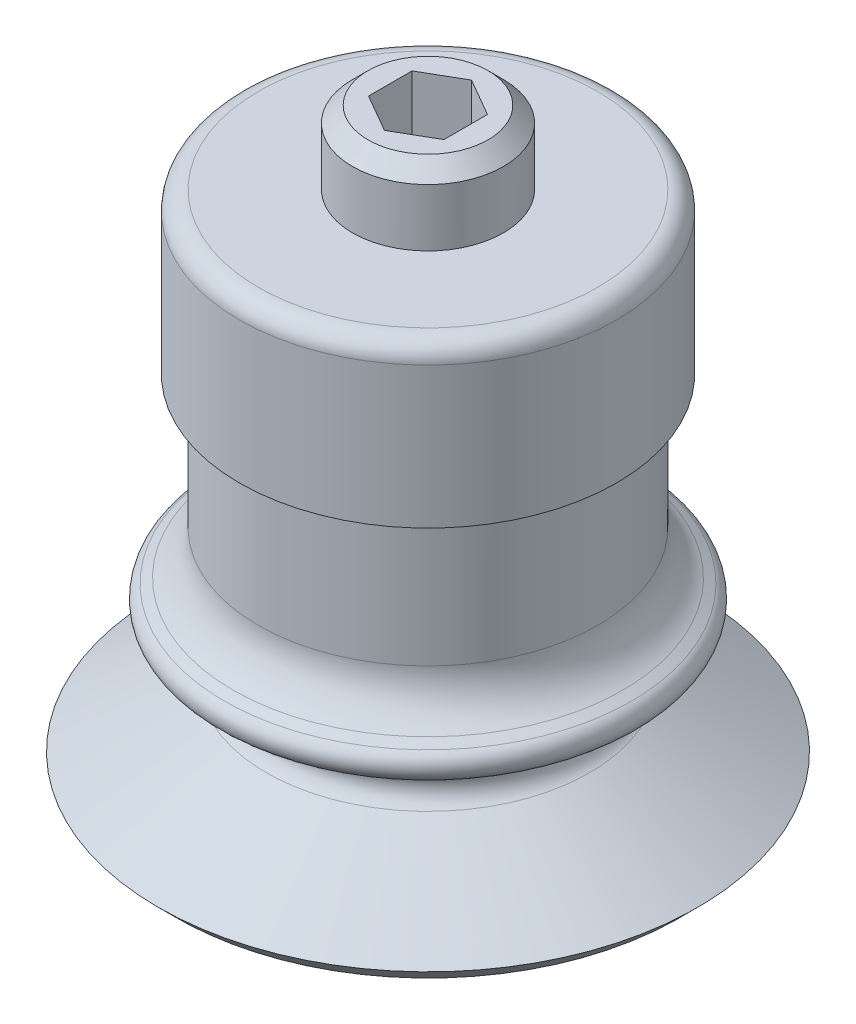
ISO-10303-21;
HEADER;
FILE_DESCRIPTION(('STEP AP214'),'2;1');
FILE_NAME('part.step','',(''),(''),'','','');
FILE_SCHEMA(('AUTOMOTIVE_DESIGN { 1 0 10303 214 1 1 1 1 }'));
ENDSEC;
DATA;
#1=APPLICATION_CONTEXT('core data for automotive mechanical design processes');
#2=APPLICATION_PROTOCOL_DEFINITION('international standard','automotive_design',2000,#1);
#3=PRODUCT_CONTEXT('',#1,'mechanical');
#4=PRODUCT('Part','Part','',(#3));
#5=PRODUCT_RELATED_PRODUCT_CATEGORY('part','',(#4));
#6=PRODUCT_DEFINITION_FORMATION('','',#4);
#7=PRODUCT_DEFINITION_CONTEXT('part definition',#1,'design');
#8=PRODUCT_DEFINITION('design','',#6,#7);
#9=PRODUCT_DEFINITION_SHAPE('','',#8);
#10=(LENGTH_UNIT() NAMED_UNIT(*) SI_UNIT(.MILLI.,.METRE.));
#11=(NAMED_UNIT(*) PLANE_ANGLE_UNIT() SI_UNIT($,.RADIAN.));
#12=(NAMED_UNIT(*) SI_UNIT($,.STERADIAN.) SOLID_ANGLE_UNIT());
#13=UNCERTAINTY_MEASURE_WITH_UNIT(LENGTH_MEASURE(1.E-05),#10,'distance_accuracy_value','');
#14=(GEOMETRIC_REPRESENTATION_CONTEXT(3) GLOBAL_UNCERTAINTY_ASSIGNED_CONTEXT((#13)) GLOBAL_UNIT_ASSIGNED_CONTEXT((#10,
#11,#12)) REPRESENTATION_CONTEXT('',''));
#15=CARTESIAN_POINT('',(0.,0.,0.));
#16=DIRECTION('',(0.,0.,1.));
#17=DIRECTION('',(1.,0.,0.));
#18=AXIS2_PLACEMENT_3D('',#15,#16,#17);
#19=CARTESIAN_POINT('',(0.,18.2,0.));
#20=DIRECTION('',(0.,1.,0.));
#21=DIRECTION('',(0.,0.,1.));
#22=AXIS2_PLACEMENT_3D('',#19,#20,#21);
#23=CYLINDRICAL_SURFACE('',#22,6.75);
#24=CARTESIAN_POINT('',(0.,8.45373864405591,0.));
#25=DIRECTION('',(0.,1.,0.));
#26=DIRECTION('',(0.,0.,1.));
#27=AXIS2_PLACEMENT_3D('',#24,#25,#26);
#28=CIRCLE('',#27,6.75);
#29=CARTESIAN_POINT('',(0.,8.45373864405591,6.75));
#30=VERTEX_POINT('',#29);
#31=EDGE_CURVE('E125',#30,#30,#28,.T.);
#32=ORIENTED_EDGE('',*,*,#31,.T.);
#33=EDGE_LOOP('',(#32));
#34=FACE_BOUND('',#33,.T.);
#35=CARTESIAN_POINT('',(0.,13.7333333333333,0.));
#36=DIRECTION('',(0.,1.,0.));
#37=DIRECTION('',(0.,0.,1.));
#38=AXIS2_PLACEMENT_3D('',#35,#36,#37);
#39=CIRCLE('',#38,6.75);
#40=CARTESIAN_POINT('',(0.,13.7333333333333,6.75));
#41=VERTEX_POINT('',#40);
#42=EDGE_CURVE('E21',#41,#41,#39,.F.);
#43=ORIENTED_EDGE('',*,*,#42,.T.);
#44=EDGE_LOOP('',(#43));
#45=FACE_BOUND('',#44,.T.);
#46=ADVANCED_FACE('F17',(#34,#45),#23,.T.);
#47=CARTESIAN_POINT('',(7.5,13.7333333333333,0.));
#48=DIRECTION('',(0.,1.,0.));
#49=DIRECTION('',(0.,0.,1.));
#50=AXIS2_PLACEMENT_3D('',#47,#48,#49);
#51=PLANE('',#50);
#52=ORIENTED_EDGE('',*,*,#42,.F.);
#53=EDGE_LOOP('',(#52));
#54=FACE_BOUND('',#53,.T.);
#55=CARTESIAN_POINT('',(0.,13.7333333333333,0.));
#56=DIRECTION('',(0.,1.,0.));
#57=DIRECTION('',(0.,0.,1.));
#58=AXIS2_PLACEMENT_3D('',#55,#56,#57);
#59=CIRCLE('',#58,7.5);
#60=CARTESIAN_POINT('',(0.,13.7333333333333,7.5));
#61=VERTEX_POINT('',#60);
#62=EDGE_CURVE('E122',#61,#61,#59,.T.);
#63=ORIENTED_EDGE('',*,*,#62,.F.);
#64=EDGE_LOOP('',(#63));
#65=FACE_BOUND('',#64,.T.);
#66=ADVANCED_FACE('F144',(#54,#65),#51,.F.);
#67=CARTESIAN_POINT('',(0.,8.45373864405591,0.));
#68=DIRECTION('',(0.,-1.,0.));
#69=DIRECTION('',(0.,0.,-1.));
#70=AXIS2_PLACEMENT_3D('',#67,#68,#69);
#71=TOROIDAL_SURFACE('',#70,8.75000000000001,2.);
#72=CARTESIAN_POINT('',(0.,6.72168783648703,0.));
#73=DIRECTION('',(0.,-1.,0.));
#74=DIRECTION('',(0.,0.,-1.));
#75=AXIS2_PLACEMENT_3D('',#72,#73,#74);
#76=CIRCLE('',#75,7.75);
#77=CARTESIAN_POINT('',(0.,6.72168783648703,-7.75));
#78=VERTEX_POINT('',#77);
#79=EDGE_CURVE('E117',#78,#78,#76,.T.);
#80=ORIENTED_EDGE('',*,*,#79,.F.);
#81=EDGE_LOOP('',(#80));
#82=FACE_BOUND('',#81,.T.);
#83=ORIENTED_EDGE('',*,*,#31,.F.);
#84=EDGE_LOOP('',(#83));
#85=FACE_BOUND('',#84,.T.);
#86=ADVANCED_FACE('F146',(#82,#85),#71,.F.);
#87=CARTESIAN_POINT('',(0.,18.2,0.));
#88=DIRECTION('',(0.,1.,0.));
#89=DIRECTION('',(0.,0.,1.));
#90=AXIS2_PLACEMENT_3D('',#87,#88,#89);
#91=CYLINDRICAL_SURFACE('',#90,7.5);
#92=ORIENTED_EDGE('',*,*,#62,.T.);
#93=EDGE_LOOP('',(#92));
#94=FACE_BOUND('',#93,.T.);
#95=CARTESIAN_POINT('',(0.,19.35,0.));
#96=DIRECTION('',(0.,1.,0.));
#97=DIRECTION('',(0.,0.,1.));
#98=AXIS2_PLACEMENT_3D('',#95,#96,#97);
#99=CIRCLE('',#98,7.5);
#100=CARTESIAN_POINT('',(0.,19.35,7.5));
#101=VERTEX_POINT('',#100);
#102=EDGE_CURVE('E112',#101,#101,#99,.T.);
#103=ORIENTED_EDGE('',*,*,#102,.F.);
#104=EDGE_LOOP('',(#103));
#105=FACE_BOUND('',#104,.T.);
#106=ADVANCED_FACE('F141',(#94,#105),#91,.T.);
#107=CARTESIAN_POINT('',(0.,6.51961524227066,0.));
#108=DIRECTION('',(0.,-1.,0.));
#109=DIRECTION('',(0.,0.,-1.));
#110=AXIS2_PLACEMENT_3D('',#107,#108,#109);
#111=CONICAL_SURFACE('',#110,8.1,1.0471975511966);
#112=CARTESIAN_POINT('',(0.,6.51961524227066,0.));
#113=DIRECTION('',(0.,-1.,0.));
#114=DIRECTION('',(0.,0.,-1.));
#115=AXIS2_PLACEMENT_3D('',#112,#113,#114);
#116=CIRCLE('',#115,8.1);
#117=CARTESIAN_POINT('',(0.,6.51961524227066,-8.1));
#118=VERTEX_POINT('',#117);
#119=EDGE_CURVE('E109',#118,#118,#116,.T.);
#120=ORIENTED_EDGE('',*,*,#119,.F.);
#121=EDGE_LOOP('',(#120));
#122=FACE_BOUND('',#121,.T.);
#123=ORIENTED_EDGE('',*,*,#79,.T.);
#124=EDGE_LOOP('',(#123));
#125=FACE_BOUND('',#124,.T.);
#126=ADVANCED_FACE('F223',(#122,#125),#111,.T.);
#127=CARTESIAN_POINT('',(0.,19.35,0.));
#128=DIRECTION('',(0.,-1.,0.));
#129=DIRECTION('',(0.,0.,-1.));
#130=AXIS2_PLACEMENT_3D('',#127,#128,#129);
#131=TOROIDAL_SURFACE('',#130,6.74999999999999,0.750000000000009);
#132=CARTESIAN_POINT('',(0.,20.1,0.));
#133=DIRECTION('',(0.,-1.,0.));
#134=DIRECTION('',(0.,0.,-1.));
#135=AXIS2_PLACEMENT_3D('',#132,#133,#134);
#136=CIRCLE('',#135,6.75);
#137=CARTESIAN_POINT('',(0.,20.1,-6.75));
#138=VERTEX_POINT('',#137);
#139=EDGE_CURVE('E106',#138,#138,#136,.T.);
#140=ORIENTED_EDGE('',*,*,#139,.T.);
#141=EDGE_LOOP('',(#140));
#142=FACE_BOUND('',#141,.T.);
#143=ORIENTED_EDGE('',*,*,#102,.T.);
#144=EDGE_LOOP('',(#143));
#145=FACE_BOUND('',#144,.T.);
#146=ADVANCED_FACE('F225',(#142,#145),#131,.T.);
#147=CARTESIAN_POINT('',(0.,5.99999999999999,0.));
#148=DIRECTION('',(0.,-1.,0.));
#149=DIRECTION('',(1.,0.,0.));
#150=AXIS2_PLACEMENT_3D('',#147,#148,#149);
#151=TOROIDAL_SURFACE('',#150,7.8,0.599999999999997);
#152=ORIENTED_EDGE('',*,*,#119,.T.);
#153=EDGE_LOOP('',(#152));
#154=FACE_BOUND('',#153,.T.);
#155=CARTESIAN_POINT('',(0.,5.48038475772934,0.));
#156=DIRECTION('',(0.,1.,0.));
#157=DIRECTION('',(-1.,0.,0.));
#158=AXIS2_PLACEMENT_3D('',#155,#156,#157);
#159=CIRCLE('',#158,8.1);
#160=CARTESIAN_POINT('',(-8.1,5.48038475772934,0.));
#161=VERTEX_POINT('',#160);
#162=EDGE_CURVE('E82',#161,#161,#159,.F.);
#163=ORIENTED_EDGE('',*,*,#162,.F.);
#164=EDGE_LOOP('',(#163));
#165=FACE_BOUND('',#164,.T.);
#166=ADVANCED_FACE('F221',(#154,#165),#151,.T.);
#167=CARTESIAN_POINT('',(-9.,20.1,0.));
#168=DIRECTION('',(0.,-1.,0.));
#169=DIRECTION('',(1.,0.,0.));
#170=AXIS2_PLACEMENT_3D('',#167,#168,#169);
#171=PLANE('',#170);
#172=ORIENTED_EDGE('',*,*,#139,.F.);
#173=EDGE_LOOP('',(#172));
#174=FACE_BOUND('',#173,.T.);
#175=CARTESIAN_POINT('',(0.,20.1,0.));
#176=DIRECTION('',(0.,1.,0.));
#177=DIRECTION('',(0.,0.,1.));
#178=AXIS2_PLACEMENT_3D('',#175,#176,#177);
#179=CIRCLE('',#178,3.);
#180=CARTESIAN_POINT('',(0.,20.1,3.));
#181=VERTEX_POINT('',#180);
#182=EDGE_CURVE('E97',#181,#181,#179,.T.);
#183=ORIENTED_EDGE('',*,*,#182,.F.);
#184=EDGE_LOOP('',(#183));
#185=FACE_BOUND('',#184,.T.);
#186=ADVANCED_FACE('F217',(#174,#185),#171,.F.);
#187=CARTESIAN_POINT('',(0.,5.48038475772934,0.));
#188=DIRECTION('',(0.,1.,0.));
#189=DIRECTION('',(-1.,0.,0.));
#190=AXIS2_PLACEMENT_3D('',#187,#188,#189);
#191=CONICAL_SURFACE('',#190,8.1,1.0471975511966);
#192=CARTESIAN_POINT('',(0.,4.51554445662277,0.));
#193=DIRECTION('',(0.,1.,0.));
#194=DIRECTION('',(0.,0.,1.));
#195=AXIS2_PLACEMENT_3D('',#192,#193,#194);
#196=CIRCLE('',#195,6.42884757729337);
#197=CARTESIAN_POINT('',(0.,4.51554445662277,6.42884757729337));
#198=VERTEX_POINT('',#197);
#199=EDGE_CURVE('E94',#198,#198,#196,.T.);
#200=ORIENTED_EDGE('',*,*,#199,.T.);
#201=EDGE_LOOP('',(#200));
#202=FACE_BOUND('',#201,.T.);
#203=ORIENTED_EDGE('',*,*,#162,.T.);
#204=EDGE_LOOP('',(#203));
#205=FACE_BOUND('',#204,.T.);
#206=ADVANCED_FACE('F214',(#202,#205),#191,.T.);
#207=CARTESIAN_POINT('',(-1.5,2.4,-0.866025403784439));
#208=DIRECTION('',(-1.,0.,0.));
#209=DIRECTION('',(0.,0.,1.));
#210=AXIS2_PLACEMENT_3D('',#207,#208,#209);
#211=PLANE('',#210);
#212=DIRECTION('',(0.,1.,0.));
#213=VECTOR('',#212,1.);
#214=CARTESIAN_POINT('',(-1.5,2.4,0.866025403784439));
#215=LINE('',#214,#213);
#216=CARTESIAN_POINT('',(-1.5,23.,0.866025403784439));
#217=VERTEX_POINT('',#216);
#218=CARTESIAN_POINT('',(-1.5,18.2,0.866025403784439));
#219=VERTEX_POINT('',#218);
#220=EDGE_CURVE('E87',#217,#219,#215,.F.);
#221=ORIENTED_EDGE('',*,*,#220,.T.);
#222=DIRECTION('',(0.,0.,1.));
#223=VECTOR('',#222,1.);
#224=CARTESIAN_POINT('',(-1.5,18.2,-0.866025403784439));
#225=LINE('',#224,#223);
#226=CARTESIAN_POINT('',(-1.5,18.2,-0.86602540378444));
#227=VERTEX_POINT('',#226);
#228=EDGE_CURVE('E74',#227,#219,#225,.T.);
#229=ORIENTED_EDGE('',*,*,#228,.F.);
#230=DIRECTION('',(0.,1.,0.));
#231=VECTOR('',#230,1.);
#232=CARTESIAN_POINT('',(-1.5,2.4,-0.866025403784441));
#233=LINE('',#232,#231);
#234=CARTESIAN_POINT('',(-1.5,23.,-0.86602540378444));
#235=VERTEX_POINT('',#234);
#236=EDGE_CURVE('E483',#227,#235,#233,.T.);
#237=ORIENTED_EDGE('',*,*,#236,.T.);
#238=DIRECTION('',(0.,0.,1.));
#239=VECTOR('',#238,1.);
#240=CARTESIAN_POINT('',(-1.5,23.,-0.866025403784439));
#241=LINE('',#240,#239);
#242=EDGE_CURVE('E69',#217,#235,#241,.F.);
#243=ORIENTED_EDGE('',*,*,#242,.F.);
#244=EDGE_LOOP('',(#221,#229,#237,#243));
#245=FACE_BOUND('',#244,.T.);
#246=ADVANCED_FACE('F93',(#245),#211,.F.);
#247=CARTESIAN_POINT('',(0.,18.2,0.));
#248=DIRECTION('',(0.,1.,0.));
#249=DIRECTION('',(0.,0.,1.));
#250=AXIS2_PLACEMENT_3D('',#247,#248,#249);
#251=CYLINDRICAL_SURFACE('',#250,3.);
#252=ORIENTED_EDGE('',*,*,#182,.T.);
#253=EDGE_LOOP('',(#252));
#254=FACE_BOUND('',#253,.T.);
#255=CARTESIAN_POINT('',(0.,22.3864999999819,0.));
#256=DIRECTION('',(0.,-1.,0.));
#257=DIRECTION('',(0.,0.,-1.));
#258=AXIS2_PLACEMENT_3D('',#255,#256,#257);
#259=CIRCLE('',#258,3.00000000004275);
#260=CARTESIAN_POINT('',(0.,22.3864999999819,-3.00000000004275));
#261=VERTEX_POINT('',#260);
#262=EDGE_CURVE('E469',#261,#261,#259,.F.);
#263=ORIENTED_EDGE('',*,*,#262,.F.);
#264=EDGE_LOOP('',(#263));
#265=FACE_BOUND('',#264,.T.);
#266=ADVANCED_FACE('F208',(#254,#265),#251,.T.);
#267=CARTESIAN_POINT('',(0.,3.86602540378444,0.));
#268=DIRECTION('',(0.,-1.,0.));
#269=DIRECTION('',(0.,0.,-1.));
#270=AXIS2_PLACEMENT_3D('',#267,#268,#269);
#271=TOROIDAL_SURFACE('',#270,6.80384757729337,0.749999999999999);
#272=CARTESIAN_POINT('',(0.,3.21650635095239,0.));
#273=DIRECTION('',(0.,-1.,0.));
#274=DIRECTION('',(0.,0.,-1.));
#275=AXIS2_PLACEMENT_3D('',#272,#273,#274);
#276=CIRCLE('',#275,6.42884757724005);
#277=CARTESIAN_POINT('',(0.,3.21650635095239,-6.42884757724005));
#278=VERTEX_POINT('',#277);
#279=EDGE_CURVE('E463',#278,#278,#276,.T.);
#280=ORIENTED_EDGE('',*,*,#279,.F.);
#281=EDGE_LOOP('',(#280));
#282=FACE_BOUND('',#281,.T.);
#283=ORIENTED_EDGE('',*,*,#199,.F.);
#284=EDGE_LOOP('',(#283));
#285=FACE_BOUND('',#284,.T.);
#286=ADVANCED_FACE('F19',(#282,#285),#271,.F.);
#287=CARTESIAN_POINT('',(-1.5,2.4,0.866025403784439));
#288=DIRECTION('',(-0.5,0.,0.866025403784439));
#289=DIRECTION('',(0.866025403784439,0.,0.5));
#290=AXIS2_PLACEMENT_3D('',#287,#288,#289);
#291=PLANE('',#290);
#292=DIRECTION('',(0.,1.,0.));
#293=VECTOR('',#292,1.);
#294=CARTESIAN_POINT('',(0.,2.4,1.73205080756888));
#295=LINE('',#294,#293);
#296=CARTESIAN_POINT('',(0.,23.,1.73205080756888));
#297=VERTEX_POINT('',#296);
#298=CARTESIAN_POINT('',(0.,18.2,1.73205080756888));
#299=VERTEX_POINT('',#298);
#300=EDGE_CURVE('E90',#297,#299,#295,.F.);
#301=ORIENTED_EDGE('',*,*,#300,.T.);
#302=DIRECTION('',(0.866025403784439,0.,0.5));
#303=VECTOR('',#302,1.);
#304=CARTESIAN_POINT('',(-1.5,18.2,0.866025403784439));
#305=LINE('',#304,#303);
#306=EDGE_CURVE('E78',#219,#299,#305,.T.);
#307=ORIENTED_EDGE('',*,*,#306,.F.);
#308=ORIENTED_EDGE('',*,*,#220,.F.);
#309=DIRECTION('',(0.866025403784439,0.,0.5));
#310=VECTOR('',#309,1.);
#311=CARTESIAN_POINT('',(-1.5,23.,0.866025403784439));
#312=LINE('',#311,#310);
#313=EDGE_CURVE('E91',#297,#217,#312,.F.);
#314=ORIENTED_EDGE('',*,*,#313,.F.);
#315=EDGE_LOOP('',(#301,#307,#308,#314));
#316=FACE_BOUND('',#315,.T.);
#317=ADVANCED_FACE('F86',(#316),#291,.F.);
#318=CARTESIAN_POINT('',(0.,2.4,-1.73205080756888));
#319=DIRECTION('',(-0.5,0.,-0.866025403784439));
#320=DIRECTION('',(-0.866025403784439,0.,0.5));
#321=AXIS2_PLACEMENT_3D('',#318,#319,#320);
#322=PLANE('',#321);
#323=ORIENTED_EDGE('',*,*,#236,.F.);
#324=DIRECTION('',(-0.866025403784439,0.,0.5));
#325=VECTOR('',#324,1.);
#326=CARTESIAN_POINT('',(0.,18.2,-1.73205080756888));
#327=LINE('',#326,#325);
#328=CARTESIAN_POINT('',(0.,18.2,-1.73205080756888));
#329=VERTEX_POINT('',#328);
#330=EDGE_CURVE('E80',#329,#227,#327,.T.);
#331=ORIENTED_EDGE('',*,*,#330,.F.);
#332=DIRECTION('',(0.,1.,0.));
#333=VECTOR('',#332,1.);
#334=CARTESIAN_POINT('',(0.,2.4,-1.73205080756888));
#335=LINE('',#334,#333);
#336=CARTESIAN_POINT('',(0.,23.,-1.73205080756888));
#337=VERTEX_POINT('',#336);
#338=EDGE_CURVE('E495',#329,#337,#335,.T.);
#339=ORIENTED_EDGE('',*,*,#338,.T.);
#340=DIRECTION('',(-0.866025403784439,0.,0.5));
#341=VECTOR('',#340,1.);
#342=CARTESIAN_POINT('',(0.,23.,-1.73205080756888));
#343=LINE('',#342,#341);
#344=EDGE_CURVE('E474',#235,#337,#343,.F.);
#345=ORIENTED_EDGE('',*,*,#344,.F.);
#346=EDGE_LOOP('',(#323,#331,#339,#345));
#347=FACE_BOUND('',#346,.T.);
#348=ADVANCED_FACE('F201',(#347),#322,.F.);
#349=CARTESIAN_POINT('',(0.,22.3865000000956,0.));
#350=DIRECTION('',(0.,-1.,0.));
#351=DIRECTION('',(0.,0.,-1.));
#352=AXIS2_PLACEMENT_3D('',#349,#350,#351);
#353=CONICAL_SURFACE('',#352,2.99999999992906,0.785398163397448);
#354=ORIENTED_EDGE('',*,*,#262,.T.);
#355=EDGE_LOOP('',(#354));
#356=FACE_BOUND('',#355,.T.);
#357=CARTESIAN_POINT('',(0.,23.0000000000246,0.));
#358=DIRECTION('',(0.,-1.,0.));
#359=DIRECTION('',(0.,0.,-1.));
#360=AXIS2_PLACEMENT_3D('',#357,#358,#359);
#361=CIRCLE('',#360,2.38650000000007);
#362=CARTESIAN_POINT('',(0.,23.0000000000246,-2.38650000000007));
#363=VERTEX_POINT('',#362);
#364=EDGE_CURVE('E130',#363,#363,#361,.T.);
#365=ORIENTED_EDGE('',*,*,#364,.T.);
#366=EDGE_LOOP('',(#365));
#367=FACE_BOUND('',#366,.T.);
#368=ADVANCED_FACE('F197',(#356,#367),#353,.T.);
#369=CARTESIAN_POINT('',(0.,0.732050807559369,0.));
#370=DIRECTION('',(0.,-1.,0.));
#371=DIRECTION('',(0.,0.,-1.));
#372=AXIS2_PLACEMENT_3D('',#369,#370,#371);
#373=CONICAL_SURFACE('',#372,10.7320508075634,1.04719755119866);
#374=CARTESIAN_POINT('',(0.,0.73205080756888,0.));
#375=DIRECTION('',(0.,1.,0.));
#376=DIRECTION('',(0.,0.,1.));
#377=AXIS2_PLACEMENT_3D('',#374,#375,#376);
#378=CIRCLE('',#377,10.7320508075689);
#379=CARTESIAN_POINT('',(0.,0.732050807568879,10.7320508075689));
#380=VERTEX_POINT('',#379);
#381=EDGE_CURVE('E133',#380,#380,#378,.F.);
#382=ORIENTED_EDGE('',*,*,#381,.F.);
#383=EDGE_LOOP('',(#382));
#384=FACE_BOUND('',#383,.T.);
#385=ORIENTED_EDGE('',*,*,#279,.T.);
#386=EDGE_LOOP('',(#385));
#387=FACE_BOUND('',#386,.T.);
#388=ADVANCED_FACE('F193',(#384,#387),#373,.T.);
#389=CARTESIAN_POINT('',(0.,2.4,1.73205080756888));
#390=DIRECTION('',(0.5,0.,0.866025403784439));
#391=DIRECTION('',(0.866025403784439,0.,-0.5));
#392=AXIS2_PLACEMENT_3D('',#389,#390,#391);
#393=PLANE('',#392);
#394=DIRECTION('',(0.,1.,0.));
#395=VECTOR('',#394,1.);
#396=CARTESIAN_POINT('',(1.5,2.4,0.86602540378444));
#397=LINE('',#396,#395);
#398=CARTESIAN_POINT('',(1.5,23.,0.86602540378444));
#399=VERTEX_POINT('',#398);
#400=CARTESIAN_POINT('',(1.5,18.2,0.86602540378444));
#401=VERTEX_POINT('',#400);
#402=EDGE_CURVE('E492',#399,#401,#397,.F.);
#403=ORIENTED_EDGE('',*,*,#402,.T.);
#404=DIRECTION('',(0.866025403784439,0.,-0.5));
#405=VECTOR('',#404,1.);
#406=CARTESIAN_POINT('',(0.,18.2,1.73205080756888));
#407=LINE('',#406,#405);
#408=EDGE_CURVE('E471',#299,#401,#407,.T.);
#409=ORIENTED_EDGE('',*,*,#408,.F.);
#410=ORIENTED_EDGE('',*,*,#300,.F.);
#411=DIRECTION('',(0.866025403784438,0.,-0.500000000000001));
#412=VECTOR('',#411,1.);
#413=CARTESIAN_POINT('',(0.,23.,1.73205080756888));
#414=LINE('',#413,#412);
#415=EDGE_CURVE('E490',#297,#399,#414,.T.);
#416=ORIENTED_EDGE('',*,*,#415,.T.);
#417=EDGE_LOOP('',(#403,#409,#410,#416));
#418=FACE_BOUND('',#417,.T.);
#419=ADVANCED_FACE('F190',(#418),#393,.F.);
#420=CARTESIAN_POINT('',(1.5,2.4,-0.866025403784439));
#421=DIRECTION('',(0.5,0.,-0.866025403784439));
#422=DIRECTION('',(-0.866025403784439,0.,-0.5));
#423=AXIS2_PLACEMENT_3D('',#420,#421,#422);
#424=PLANE('',#423);
#425=ORIENTED_EDGE('',*,*,#338,.F.);
#426=DIRECTION('',(-0.866025403784439,0.,-0.5));
#427=VECTOR('',#426,1.);
#428=CARTESIAN_POINT('',(1.5,18.2,-0.866025403784439));
#429=LINE('',#428,#427);
#430=CARTESIAN_POINT('',(1.5,18.2,-0.866025403784438));
#431=VERTEX_POINT('',#430);
#432=EDGE_CURVE('E36',#431,#329,#429,.T.);
#433=ORIENTED_EDGE('',*,*,#432,.F.);
#434=DIRECTION('',(0.,1.,0.));
#435=VECTOR('',#434,1.);
#436=CARTESIAN_POINT('',(1.5,2.4,-0.866025403784438));
#437=LINE('',#436,#435);
#438=CARTESIAN_POINT('',(1.5,23.,-0.866025403784439));
#439=VERTEX_POINT('',#438);
#440=EDGE_CURVE('E508',#431,#439,#437,.T.);
#441=ORIENTED_EDGE('',*,*,#440,.T.);
#442=DIRECTION('',(-0.866025403784438,0.,-0.500000000000001));
#443=VECTOR('',#442,1.);
#444=CARTESIAN_POINT('',(1.5,23.,-0.866025403784438));
#445=LINE('',#444,#443);
#446=EDGE_CURVE('E134',#439,#337,#445,.T.);
#447=ORIENTED_EDGE('',*,*,#446,.T.);
#448=EDGE_LOOP('',(#425,#433,#441,#447));
#449=FACE_BOUND('',#448,.T.);
#450=ADVANCED_FACE('F186',(#449),#424,.F.);
#451=CARTESIAN_POINT('',(0.,23.,0.));
#452=DIRECTION('',(0.,-1.,0.));
#453=DIRECTION('',(0.,0.,-1.));
#454=AXIS2_PLACEMENT_3D('',#451,#452,#453);
#455=PLANE('',#454);
#456=ORIENTED_EDGE('',*,*,#364,.F.);
#457=EDGE_LOOP('',(#456));
#458=FACE_BOUND('',#457,.T.);
#459=ORIENTED_EDGE('',*,*,#242,.T.);
#460=ORIENTED_EDGE('',*,*,#344,.T.);
#461=ORIENTED_EDGE('',*,*,#446,.F.);
#462=DIRECTION('',(0.,0.,-1.));
#463=VECTOR('',#462,1.);
#464=CARTESIAN_POINT('',(1.5,23.,0.866025403784439));
#465=LINE('',#464,#463);
#466=EDGE_CURVE('E510',#439,#399,#465,.F.);
#467=ORIENTED_EDGE('',*,*,#466,.T.);
#468=ORIENTED_EDGE('',*,*,#415,.F.);
#469=ORIENTED_EDGE('',*,*,#313,.T.);
#470=EDGE_LOOP('',(#459,#460,#461,#467,#468,#469));
#471=FACE_BOUND('',#470,.T.);
#472=ADVANCED_FACE('F182',(#458,#471),#455,.F.);
#473=CARTESIAN_POINT('',(0.,0.73205080756888,0.));
#474=DIRECTION('',(0.,1.,0.));
#475=DIRECTION('',(0.,0.,1.));
#476=AXIS2_PLACEMENT_3D('',#473,#474,#475);
#477=CONICAL_SURFACE('',#476,10.7320508075689,0.785398163397448);
#478=CARTESIAN_POINT('',(0.,0.,0.));
#479=DIRECTION('',(0.,-1.,0.));
#480=DIRECTION('',(0.,0.,-1.));
#481=AXIS2_PLACEMENT_3D('',#478,#479,#480);
#482=CIRCLE('',#481,10.);
#483=CARTESIAN_POINT('',(0.,0.,-10.));
#484=VERTEX_POINT('',#483);
#485=EDGE_CURVE('E512',#484,#484,#482,.F.);
#486=ORIENTED_EDGE('',*,*,#485,.T.);
#487=EDGE_LOOP('',(#486));
#488=FACE_BOUND('',#487,.T.);
#489=ORIENTED_EDGE('',*,*,#381,.T.);
#490=EDGE_LOOP('',(#489));
#491=FACE_BOUND('',#490,.T.);
#492=ADVANCED_FACE('F178',(#488,#491),#477,.T.);
#493=CARTESIAN_POINT('',(1.5,2.4,0.866025403784439));
#494=DIRECTION('',(1.,0.,0.));
#495=DIRECTION('',(0.,0.,-1.));
#496=AXIS2_PLACEMENT_3D('',#493,#494,#495);
#497=PLANE('',#496);
#498=ORIENTED_EDGE('',*,*,#440,.F.);
#499=DIRECTION('',(0.,0.,1.));
#500=VECTOR('',#499,1.);
#501=CARTESIAN_POINT('',(1.5,18.2,0.));
#502=LINE('',#501,#500);
#503=EDGE_CURVE('E517',#431,#401,#502,.T.);
#504=ORIENTED_EDGE('',*,*,#503,.T.);
#505=ORIENTED_EDGE('',*,*,#402,.F.);
#506=ORIENTED_EDGE('',*,*,#466,.F.);
#507=EDGE_LOOP('',(#498,#504,#505,#506));
#508=FACE_BOUND('',#507,.T.);
#509=ADVANCED_FACE('F174',(#508),#497,.F.);
#510=CARTESIAN_POINT('',(0.,0.,0.));
#511=DIRECTION('',(0.,-1.,0.));
#512=DIRECTION('',(0.,0.,-1.));
#513=AXIS2_PLACEMENT_3D('',#510,#511,#512);
#514=CONICAL_SURFACE('',#513,10.,1.0471975511966);
#515=CARTESIAN_POINT('',(0.,2.74241377865072,0.));
#516=DIRECTION('',(0.,1.,0.));
#517=DIRECTION('',(0.,0.,1.));
#518=AXIS2_PLACEMENT_3D('',#515,#516,#517);
#519=CIRCLE('',#518,5.25);
#520=CARTESIAN_POINT('',(0.,2.74241377865072,5.25));
#521=VERTEX_POINT('',#520);
#522=EDGE_CURVE('E27',#521,#521,#519,.T.);
#523=ORIENTED_EDGE('',*,*,#522,.T.);
#524=EDGE_LOOP('',(#523));
#525=FACE_BOUND('',#524,.T.);
#526=ORIENTED_EDGE('',*,*,#485,.F.);
#527=EDGE_LOOP('',(#526));
#528=FACE_BOUND('',#527,.T.);
#529=ADVANCED_FACE('F167',(#525,#528),#514,.F.);
#530=CARTESIAN_POINT('',(5.25,18.2,0.));
#531=DIRECTION('',(0.,1.,0.));
#532=DIRECTION('',(0.,0.,1.));
#533=AXIS2_PLACEMENT_3D('',#530,#531,#532);
#534=PLANE('',#533);
#535=ORIENTED_EDGE('',*,*,#432,.T.);
#536=ORIENTED_EDGE('',*,*,#330,.T.);
#537=ORIENTED_EDGE('',*,*,#228,.T.);
#538=ORIENTED_EDGE('',*,*,#306,.T.);
#539=ORIENTED_EDGE('',*,*,#408,.T.);
#540=ORIENTED_EDGE('',*,*,#503,.F.);
#541=EDGE_LOOP('',(#535,#536,#537,#538,#539,#540));
#542=FACE_BOUND('',#541,.T.);
#543=CARTESIAN_POINT('',(0.,18.2,0.));
#544=DIRECTION('',(0.,1.,0.));
#545=DIRECTION('',(0.,0.,1.));
#546=AXIS2_PLACEMENT_3D('',#543,#544,#545);
#547=CIRCLE('',#546,5.25);
#548=CARTESIAN_POINT('',(0.,18.2,5.25));
#549=VERTEX_POINT('',#548);
#550=EDGE_CURVE('E11',#549,#549,#547,.F.);
#551=ORIENTED_EDGE('',*,*,#550,.T.);
#552=EDGE_LOOP('',(#551));
#553=FACE_BOUND('',#552,.T.);
#554=ADVANCED_FACE('F76',(#542,#553),#534,.F.);
#555=CARTESIAN_POINT('',(0.,18.2,0.));
#556=DIRECTION('',(0.,1.,0.));
#557=DIRECTION('',(0.,0.,1.));
#558=AXIS2_PLACEMENT_3D('',#555,#556,#557);
#559=CYLINDRICAL_SURFACE('',#558,5.25);
#560=ORIENTED_EDGE('',*,*,#550,.F.);
#561=EDGE_LOOP('',(#560));
#562=FACE_BOUND('',#561,.T.);
#563=ORIENTED_EDGE('',*,*,#522,.F.);
#564=EDGE_LOOP('',(#563));
#565=FACE_BOUND('',#564,.T.);
#566=ADVANCED_FACE('F160',(#562,#565),#559,.F.);
#567=CLOSED_SHELL('',(#46,#66,#86,#106,#126,#146,#166,#186,#206,#246,#266,#286,#317,#348,#368,
#388,#419,#450,#472,#492,#509,#529,#554,#566));
#568=MANIFOLD_SOLID_BREP('B1',#567);
#569=ADVANCED_BREP_SHAPE_REPRESENTATION('',(#18,#568),#14);
#570=SHAPE_DEFINITION_REPRESENTATION(#9,#569);
ENDSEC;
END-ISO-10303-21;
